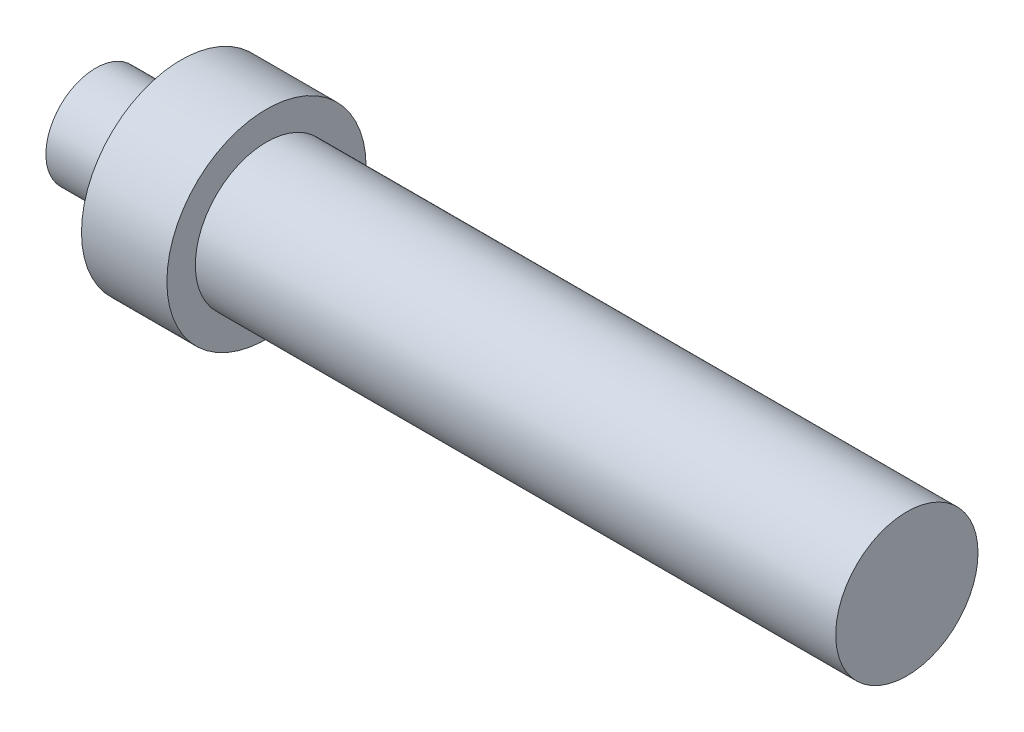
ISO-10303-21;
HEADER;
FILE_DESCRIPTION(('STEP AP214'),'2;1');
FILE_NAME('part.step','',(''),(''),'','','');
FILE_SCHEMA(('AUTOMOTIVE_DESIGN { 1 0 10303 214 1 1 1 1 }'));
ENDSEC;
DATA;
#1=APPLICATION_CONTEXT('core data for automotive mechanical design processes');
#2=APPLICATION_PROTOCOL_DEFINITION('international standard','automotive_design',2000,#1);
#3=PRODUCT_CONTEXT('',#1,'mechanical');
#4=PRODUCT('Part','Part','',(#3));
#5=PRODUCT_RELATED_PRODUCT_CATEGORY('part','',(#4));
#6=PRODUCT_DEFINITION_FORMATION('','',#4);
#7=PRODUCT_DEFINITION_CONTEXT('part definition',#1,'design');
#8=PRODUCT_DEFINITION('design','',#6,#7);
#9=PRODUCT_DEFINITION_SHAPE('','',#8);
#10=(LENGTH_UNIT() NAMED_UNIT(*) SI_UNIT(.MILLI.,.METRE.));
#11=(NAMED_UNIT(*) PLANE_ANGLE_UNIT() SI_UNIT($,.RADIAN.));
#12=(NAMED_UNIT(*) SI_UNIT($,.STERADIAN.) SOLID_ANGLE_UNIT());
#13=UNCERTAINTY_MEASURE_WITH_UNIT(LENGTH_MEASURE(1.E-05),#10,'distance_accuracy_value','');
#14=(GEOMETRIC_REPRESENTATION_CONTEXT(3) GLOBAL_UNCERTAINTY_ASSIGNED_CONTEXT((#13)) GLOBAL_UNIT_ASSIGNED_CONTEXT((#10,
#11,#12)) REPRESENTATION_CONTEXT('',''));
#15=CARTESIAN_POINT('',(0.,0.,0.));
#16=DIRECTION('',(0.,0.,1.));
#17=DIRECTION('',(1.,0.,0.));
#18=AXIS2_PLACEMENT_3D('',#15,#16,#17);
#19=CARTESIAN_POINT('',(0.,0.,0.));
#20=DIRECTION('',(-1.,0.,0.));
#21=DIRECTION('',(0.,0.,1.));
#22=AXIS2_PLACEMENT_3D('',#19,#20,#21);
#23=PLANE('',#22);
#24=CARTESIAN_POINT('',(0.,0.,0.));
#25=DIRECTION('',(1.,0.,0.));
#26=DIRECTION('',(0.,0.,-1.));
#27=AXIS2_PLACEMENT_3D('',#24,#25,#26);
#28=CIRCLE('',#27,3.5);
#29=CARTESIAN_POINT('',(0.,0.,-3.5));
#30=VERTEX_POINT('',#29);
#31=EDGE_CURVE('E10',#30,#30,#28,.T.);
#32=ORIENTED_EDGE('',*,*,#31,.F.);
#33=EDGE_LOOP('',(#32));
#34=FACE_BOUND('',#33,.T.);
#35=ADVANCED_FACE('F37',(#34),#23,.T.);
#36=CARTESIAN_POINT('',(57.,0.,0.));
#37=DIRECTION('',(1.,0.,0.));
#38=DIRECTION('',(0.,0.,-1.));
#39=AXIS2_PLACEMENT_3D('',#36,#37,#38);
#40=CYLINDRICAL_SURFACE('',#39,3.5);
#41=ORIENTED_EDGE('',*,*,#31,.T.);
#42=EDGE_LOOP('',(#41));
#43=FACE_BOUND('',#42,.T.);
#44=CARTESIAN_POINT('',(6.,0.,0.));
#45=DIRECTION('',(1.,0.,0.));
#46=DIRECTION('',(0.,0.,-1.));
#47=AXIS2_PLACEMENT_3D('',#44,#45,#46);
#48=CIRCLE('',#47,3.5);
#49=CARTESIAN_POINT('',(6.,0.,-3.5));
#50=VERTEX_POINT('',#49);
#51=EDGE_CURVE('E44',#50,#50,#48,.T.);
#52=ORIENTED_EDGE('',*,*,#51,.F.);
#53=EDGE_LOOP('',(#52));
#54=FACE_BOUND('',#53,.T.);
#55=ADVANCED_FACE('F85',(#43,#54),#40,.T.);
#56=CARTESIAN_POINT('',(6.,3.5,0.));
#57=DIRECTION('',(-1.,0.,0.));
#58=DIRECTION('',(0.,0.,1.));
#59=AXIS2_PLACEMENT_3D('',#56,#57,#58);
#60=PLANE('',#59);
#61=ORIENTED_EDGE('',*,*,#51,.T.);
#62=EDGE_LOOP('',(#61));
#63=FACE_BOUND('',#62,.T.);
#64=CARTESIAN_POINT('',(6.,0.,0.));
#65=DIRECTION('',(1.,0.,0.));
#66=DIRECTION('',(0.,0.,-1.));
#67=AXIS2_PLACEMENT_3D('',#64,#65,#66);
#68=CIRCLE('',#67,7.);
#69=CARTESIAN_POINT('',(6.,0.,-7.));
#70=VERTEX_POINT('',#69);
#71=EDGE_CURVE('E49',#70,#70,#68,.T.);
#72=ORIENTED_EDGE('',*,*,#71,.F.);
#73=EDGE_LOOP('',(#72));
#74=FACE_BOUND('',#73,.T.);
#75=ADVANCED_FACE('F90',(#63,#74),#60,.T.);
#76=CARTESIAN_POINT('',(57.,0.,0.));
#77=DIRECTION('',(1.,0.,0.));
#78=DIRECTION('',(0.,0.,-1.));
#79=AXIS2_PLACEMENT_3D('',#76,#77,#78);
#80=CYLINDRICAL_SURFACE('',#79,7.);
#81=ORIENTED_EDGE('',*,*,#71,.T.);
#82=EDGE_LOOP('',(#81));
#83=FACE_BOUND('',#82,.T.);
#84=CARTESIAN_POINT('',(12.,0.,0.));
#85=DIRECTION('',(1.,0.,0.));
#86=DIRECTION('',(0.,0.,-1.));
#87=AXIS2_PLACEMENT_3D('',#84,#85,#86);
#88=CIRCLE('',#87,7.);
#89=CARTESIAN_POINT('',(12.,0.,-7.));
#90=VERTEX_POINT('',#89);
#91=EDGE_CURVE('E54',#90,#90,#88,.T.);
#92=ORIENTED_EDGE('',*,*,#91,.F.);
#93=EDGE_LOOP('',(#92));
#94=FACE_BOUND('',#93,.T.);
#95=ADVANCED_FACE('F81',(#83,#94),#80,.T.);
#96=CARTESIAN_POINT('',(12.,7.,0.));
#97=DIRECTION('',(1.,0.,0.));
#98=DIRECTION('',(0.,0.,-1.));
#99=AXIS2_PLACEMENT_3D('',#96,#97,#98);
#100=PLANE('',#99);
#101=ORIENTED_EDGE('',*,*,#91,.T.);
#102=EDGE_LOOP('',(#101));
#103=FACE_BOUND('',#102,.T.);
#104=CARTESIAN_POINT('',(12.,0.,0.));
#105=DIRECTION('',(1.,0.,0.));
#106=DIRECTION('',(0.,0.,-1.));
#107=AXIS2_PLACEMENT_3D('',#104,#105,#106);
#108=CIRCLE('',#107,5.);
#109=CARTESIAN_POINT('',(12.,0.,-5.));
#110=VERTEX_POINT('',#109);
#111=EDGE_CURVE('E60',#110,#110,#108,.T.);
#112=ORIENTED_EDGE('',*,*,#111,.F.);
#113=EDGE_LOOP('',(#112));
#114=FACE_BOUND('',#113,.T.);
#115=ADVANCED_FACE('F73',(#103,#114),#100,.T.);
#116=CARTESIAN_POINT('',(57.,0.,0.));
#117=DIRECTION('',(1.,0.,0.));
#118=DIRECTION('',(0.,0.,-1.));
#119=AXIS2_PLACEMENT_3D('',#116,#117,#118);
#120=CYLINDRICAL_SURFACE('',#119,5.);
#121=ORIENTED_EDGE('',*,*,#111,.T.);
#122=EDGE_LOOP('',(#121));
#123=FACE_BOUND('',#122,.T.);
#124=CARTESIAN_POINT('',(57.,0.,0.));
#125=DIRECTION('',(1.,0.,0.));
#126=DIRECTION('',(0.,0.,-1.));
#127=AXIS2_PLACEMENT_3D('',#124,#125,#126);
#128=CIRCLE('',#127,5.);
#129=CARTESIAN_POINT('',(57.,0.,-5.));
#130=VERTEX_POINT('',#129);
#131=EDGE_CURVE('E64',#130,#130,#128,.T.);
#132=ORIENTED_EDGE('',*,*,#131,.F.);
#133=EDGE_LOOP('',(#132));
#134=FACE_BOUND('',#133,.T.);
#135=ADVANCED_FACE('F71',(#123,#134),#120,.T.);
#136=CARTESIAN_POINT('',(57.,5.,0.));
#137=DIRECTION('',(1.,0.,0.));
#138=DIRECTION('',(0.,0.,-1.));
#139=AXIS2_PLACEMENT_3D('',#136,#137,#138);
#140=PLANE('',#139);
#141=ORIENTED_EDGE('',*,*,#131,.T.);
#142=EDGE_LOOP('',(#141));
#143=FACE_BOUND('',#142,.T.);
#144=ADVANCED_FACE('F69',(#143),#140,.T.);
#145=CLOSED_SHELL('',(#35,#55,#75,#95,#115,#135,#144));
#146=MANIFOLD_SOLID_BREP('B2',#145);
#147=ADVANCED_BREP_SHAPE_REPRESENTATION('',(#18,#146),#14);
#148=SHAPE_DEFINITION_REPRESENTATION(#9,#147);
ENDSEC;
END-ISO-10303-21;
